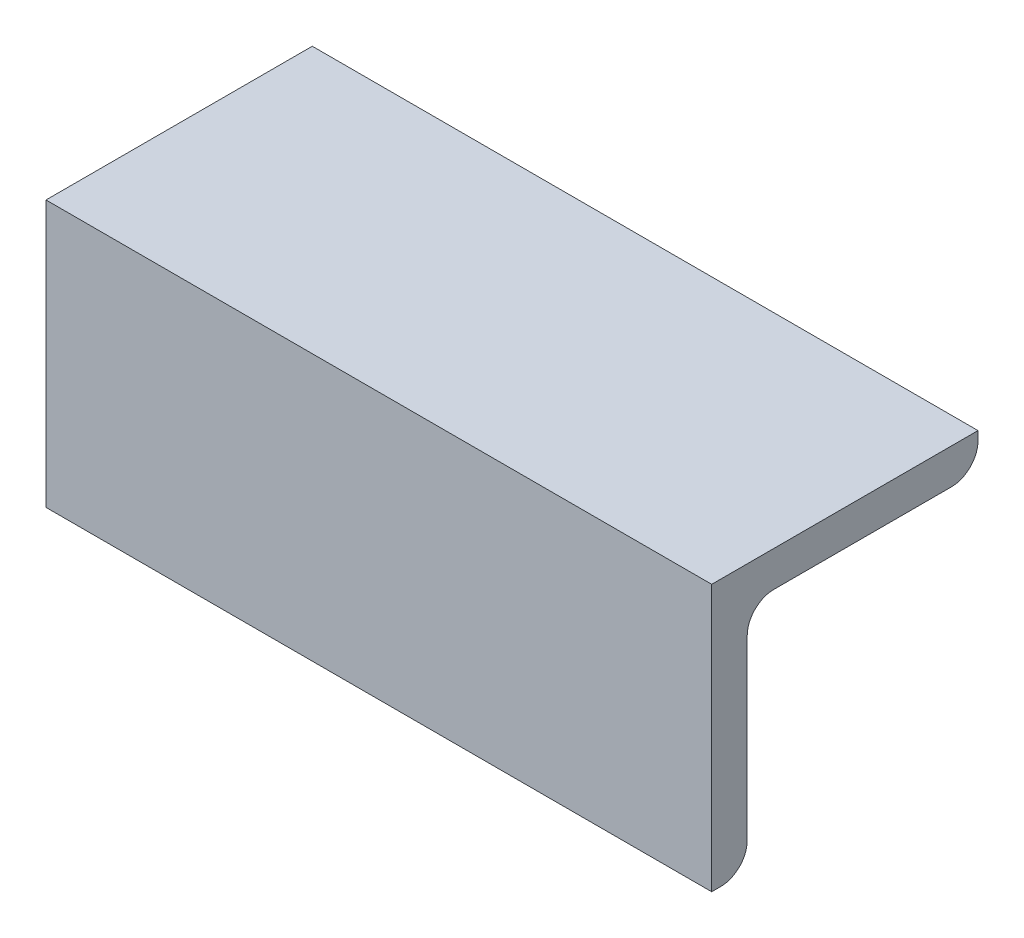
ISO-10303-21;
HEADER;
FILE_DESCRIPTION(('STEP AP214'),'2;1');
FILE_NAME('part.step','',(''),(''),'','','');
FILE_SCHEMA(('AUTOMOTIVE_DESIGN { 1 0 10303 214 1 1 1 1 }'));
ENDSEC;
DATA;
#1=APPLICATION_CONTEXT('core data for automotive mechanical design processes');
#2=APPLICATION_PROTOCOL_DEFINITION('international standard','automotive_design',2000,#1);
#3=PRODUCT_CONTEXT('',#1,'mechanical');
#4=PRODUCT('Part','Part','',(#3));
#5=PRODUCT_RELATED_PRODUCT_CATEGORY('part','',(#4));
#6=PRODUCT_DEFINITION_FORMATION('','',#4);
#7=PRODUCT_DEFINITION_CONTEXT('part definition',#1,'design');
#8=PRODUCT_DEFINITION('design','',#6,#7);
#9=PRODUCT_DEFINITION_SHAPE('','',#8);
#10=(LENGTH_UNIT() NAMED_UNIT(*) SI_UNIT(.MILLI.,.METRE.));
#11=(NAMED_UNIT(*) PLANE_ANGLE_UNIT() SI_UNIT($,.RADIAN.));
#12=(NAMED_UNIT(*) SI_UNIT($,.STERADIAN.) SOLID_ANGLE_UNIT());
#13=UNCERTAINTY_MEASURE_WITH_UNIT(LENGTH_MEASURE(1.E-05),#10,'distance_accuracy_value','');
#14=(GEOMETRIC_REPRESENTATION_CONTEXT(3) GLOBAL_UNCERTAINTY_ASSIGNED_CONTEXT((#13)) GLOBAL_UNIT_ASSIGNED_CONTEXT((#10,
#11,#12)) REPRESENTATION_CONTEXT('',''));
#15=CARTESIAN_POINT('',(0.,0.,0.));
#16=DIRECTION('',(0.,0.,1.));
#17=DIRECTION('',(1.,0.,0.));
#18=AXIS2_PLACEMENT_3D('',#15,#16,#17);
#19=CARTESIAN_POINT('',(75.,15.289592760181,0.));
#20=DIRECTION('',(0.,0.,1.));
#21=DIRECTION('',(0.,-1.,0.));
#22=AXIS2_PLACEMENT_3D('',#19,#20,#21);
#23=PLANE('',#22);
#24=DIRECTION('',(0.,1.,0.));
#25=VECTOR('',#24,1.);
#26=CARTESIAN_POINT('',(0.,15.289592760181,0.));
#27=LINE('',#26,#25);
#28=CARTESIAN_POINT('',(0.,15.289592760181,0.));
#29=VERTEX_POINT('',#28);
#30=CARTESIAN_POINT('',(0.,16.289592760181,0.));
#31=VERTEX_POINT('',#30);
#32=EDGE_CURVE('E135',#29,#31,#27,.T.);
#33=ORIENTED_EDGE('',*,*,#32,.T.);
#34=DIRECTION('',(-1.,0.,0.));
#35=VECTOR('',#34,1.);
#36=CARTESIAN_POINT('',(75.,16.289592760181,0.));
#37=LINE('',#36,#35);
#38=CARTESIAN_POINT('',(75.,16.289592760181,0.));
#39=VERTEX_POINT('',#38);
#40=EDGE_CURVE('E11',#39,#31,#37,.T.);
#41=ORIENTED_EDGE('',*,*,#40,.F.);
#42=DIRECTION('',(0.,1.,0.));
#43=VECTOR('',#42,1.);
#44=CARTESIAN_POINT('',(75.,15.289592760181,0.));
#45=LINE('',#44,#43);
#46=CARTESIAN_POINT('',(75.,15.289592760181,0.));
#47=VERTEX_POINT('',#46);
#48=EDGE_CURVE('E151',#47,#39,#45,.T.);
#49=ORIENTED_EDGE('',*,*,#48,.F.);
#50=DIRECTION('',(-1.,0.,0.));
#51=VECTOR('',#50,1.);
#52=CARTESIAN_POINT('',(75.,15.289592760181,0.));
#53=LINE('',#52,#51);
#54=EDGE_CURVE('E131',#47,#29,#53,.T.);
#55=ORIENTED_EDGE('',*,*,#54,.T.);
#56=EDGE_LOOP('',(#33,#41,#49,#55));
#57=FACE_BOUND('',#56,.T.);
#58=ADVANCED_FACE('F33',(#57),#23,.F.);
#59=CARTESIAN_POINT('',(75.,16.289592760181,0.));
#60=DIRECTION('',(0.,-1.,0.));
#61=DIRECTION('',(0.,0.,-1.));
#62=AXIS2_PLACEMENT_3D('',#59,#60,#61);
#63=PLANE('',#62);
#64=DIRECTION('',(0.,0.,1.));
#65=VECTOR('',#64,1.);
#66=CARTESIAN_POINT('',(0.,16.289592760181,0.));
#67=LINE('',#66,#65);
#68=CARTESIAN_POINT('',(0.,16.289592760181,30.));
#69=VERTEX_POINT('',#68);
#70=EDGE_CURVE('E138',#31,#69,#67,.T.);
#71=ORIENTED_EDGE('',*,*,#70,.T.);
#72=DIRECTION('',(-1.,0.,0.));
#73=VECTOR('',#72,1.);
#74=CARTESIAN_POINT('',(75.,16.289592760181,30.));
#75=LINE('',#74,#73);
#76=CARTESIAN_POINT('',(75.,16.289592760181,30.));
#77=VERTEX_POINT('',#76);
#78=EDGE_CURVE('E41',#77,#69,#75,.T.);
#79=ORIENTED_EDGE('',*,*,#78,.F.);
#80=DIRECTION('',(0.,0.,1.));
#81=VECTOR('',#80,1.);
#82=CARTESIAN_POINT('',(75.,16.289592760181,0.));
#83=LINE('',#82,#81);
#84=EDGE_CURVE('E95',#39,#77,#83,.T.);
#85=ORIENTED_EDGE('',*,*,#84,.F.);
#86=ORIENTED_EDGE('',*,*,#40,.T.);
#87=EDGE_LOOP('',(#71,#79,#85,#86));
#88=FACE_BOUND('',#87,.T.);
#89=ADVANCED_FACE('F194',(#88),#63,.F.);
#90=CARTESIAN_POINT('',(75.,16.289592760181,30.));
#91=DIRECTION('',(0.,0.,-1.));
#92=DIRECTION('',(-1.,0.,0.));
#93=AXIS2_PLACEMENT_3D('',#90,#91,#92);
#94=PLANE('',#93);
#95=DIRECTION('',(0.,-1.,0.));
#96=VECTOR('',#95,1.);
#97=CARTESIAN_POINT('',(0.,16.289592760181,30.));
#98=LINE('',#97,#96);
#99=CARTESIAN_POINT('',(0.,-13.710407239819,30.));
#100=VERTEX_POINT('',#99);
#101=EDGE_CURVE('E140',#69,#100,#98,.T.);
#102=ORIENTED_EDGE('',*,*,#101,.T.);
#103=DIRECTION('',(-1.,0.,0.));
#104=VECTOR('',#103,1.);
#105=CARTESIAN_POINT('',(75.,-13.710407239819,30.));
#106=LINE('',#105,#104);
#107=CARTESIAN_POINT('',(75.,-13.710407239819,30.));
#108=VERTEX_POINT('',#107);
#109=EDGE_CURVE('E161',#108,#100,#106,.T.);
#110=ORIENTED_EDGE('',*,*,#109,.F.);
#111=DIRECTION('',(0.,-1.,0.));
#112=VECTOR('',#111,1.);
#113=CARTESIAN_POINT('',(75.,16.289592760181,30.));
#114=LINE('',#113,#112);
#115=EDGE_CURVE('E169',#77,#108,#114,.T.);
#116=ORIENTED_EDGE('',*,*,#115,.F.);
#117=ORIENTED_EDGE('',*,*,#78,.T.);
#118=EDGE_LOOP('',(#102,#110,#116,#117));
#119=FACE_BOUND('',#118,.T.);
#120=ADVANCED_FACE('F167',(#119),#94,.F.);
#121=CARTESIAN_POINT('',(75.,-13.710407239819,30.));
#122=DIRECTION('',(0.,1.,0.));
#123=DIRECTION('',(0.,0.,1.));
#124=AXIS2_PLACEMENT_3D('',#121,#122,#123);
#125=PLANE('',#124);
#126=DIRECTION('',(0.,0.,-1.));
#127=VECTOR('',#126,1.);
#128=CARTESIAN_POINT('',(0.,-13.710407239819,30.));
#129=LINE('',#128,#127);
#130=CARTESIAN_POINT('',(0.,-13.710407239819,29.));
#131=VERTEX_POINT('',#130);
#132=EDGE_CURVE('E142',#100,#131,#129,.T.);
#133=ORIENTED_EDGE('',*,*,#132,.T.);
#134=DIRECTION('',(-1.,0.,0.));
#135=VECTOR('',#134,1.);
#136=CARTESIAN_POINT('',(75.,-13.710407239819,29.));
#137=LINE('',#136,#135);
#138=CARTESIAN_POINT('',(75.,-13.710407239819,29.));
#139=VERTEX_POINT('',#138);
#140=EDGE_CURVE('E158',#139,#131,#137,.T.);
#141=ORIENTED_EDGE('',*,*,#140,.F.);
#142=DIRECTION('',(0.,0.,-1.));
#143=VECTOR('',#142,1.);
#144=CARTESIAN_POINT('',(75.,-13.710407239819,30.));
#145=LINE('',#144,#143);
#146=EDGE_CURVE('E185',#108,#139,#145,.T.);
#147=ORIENTED_EDGE('',*,*,#146,.F.);
#148=ORIENTED_EDGE('',*,*,#109,.T.);
#149=EDGE_LOOP('',(#133,#141,#147,#148));
#150=FACE_BOUND('',#149,.T.);
#151=ADVANCED_FACE('F178',(#150),#125,.F.);
#152=CARTESIAN_POINT('',(75.,-10.710407239819,29.));
#153=DIRECTION('',(-1.,0.,0.));
#154=DIRECTION('',(0.,0.,1.));
#155=AXIS2_PLACEMENT_3D('',#152,#153,#154);
#156=CYLINDRICAL_SURFACE('',#155,3.);
#157=CARTESIAN_POINT('',(0.,-10.710407239819,29.));
#158=DIRECTION('',(1.,0.,0.));
#159=DIRECTION('',(0.,0.,-1.));
#160=AXIS2_PLACEMENT_3D('',#157,#158,#159);
#161=CIRCLE('',#160,3.);
#162=CARTESIAN_POINT('',(0.,-10.710407239819,26.));
#163=VERTEX_POINT('',#162);
#164=EDGE_CURVE('E144',#131,#163,#161,.T.);
#165=ORIENTED_EDGE('',*,*,#164,.T.);
#166=DIRECTION('',(-1.,0.,0.));
#167=VECTOR('',#166,1.);
#168=CARTESIAN_POINT('',(75.,-10.710407239819,26.));
#169=LINE('',#168,#167);
#170=CARTESIAN_POINT('',(75.,-10.710407239819,26.));
#171=VERTEX_POINT('',#170);
#172=EDGE_CURVE('E155',#171,#163,#169,.T.);
#173=ORIENTED_EDGE('',*,*,#172,.F.);
#174=CARTESIAN_POINT('',(75.,-10.710407239819,29.));
#175=DIRECTION('',(1.,0.,0.));
#176=DIRECTION('',(0.,0.,-1.));
#177=AXIS2_PLACEMENT_3D('',#174,#175,#176);
#178=CIRCLE('',#177,3.);
#179=EDGE_CURVE('E184',#139,#171,#178,.T.);
#180=ORIENTED_EDGE('',*,*,#179,.F.);
#181=ORIENTED_EDGE('',*,*,#140,.T.);
#182=EDGE_LOOP('',(#165,#173,#180,#181));
#183=FACE_BOUND('',#182,.T.);
#184=ADVANCED_FACE('F182',(#183),#156,.T.);
#185=CARTESIAN_POINT('',(75.,-10.710407239819,26.));
#186=DIRECTION('',(0.,0.,1.));
#187=DIRECTION('',(1.,0.,0.));
#188=AXIS2_PLACEMENT_3D('',#185,#186,#187);
#189=PLANE('',#188);
#190=DIRECTION('',(0.,1.,0.));
#191=VECTOR('',#190,1.);
#192=CARTESIAN_POINT('',(0.,-10.710407239819,26.));
#193=LINE('',#192,#191);
#194=CARTESIAN_POINT('',(0.,9.28959276018097,26.));
#195=VERTEX_POINT('',#194);
#196=EDGE_CURVE('E146',#163,#195,#193,.T.);
#197=ORIENTED_EDGE('',*,*,#196,.T.);
#198=DIRECTION('',(-1.,0.,0.));
#199=VECTOR('',#198,1.);
#200=CARTESIAN_POINT('',(75.,9.28959276018097,26.));
#201=LINE('',#200,#199);
#202=CARTESIAN_POINT('',(75.,9.28959276018097,26.));
#203=VERTEX_POINT('',#202);
#204=EDGE_CURVE('E126',#203,#195,#201,.T.);
#205=ORIENTED_EDGE('',*,*,#204,.F.);
#206=DIRECTION('',(0.,1.,0.));
#207=VECTOR('',#206,1.);
#208=CARTESIAN_POINT('',(75.,-10.710407239819,26.));
#209=LINE('',#208,#207);
#210=EDGE_CURVE('E117',#171,#203,#209,.T.);
#211=ORIENTED_EDGE('',*,*,#210,.F.);
#212=ORIENTED_EDGE('',*,*,#172,.T.);
#213=EDGE_LOOP('',(#197,#205,#211,#212));
#214=FACE_BOUND('',#213,.T.);
#215=ADVANCED_FACE('F206',(#214),#189,.F.);
#216=CARTESIAN_POINT('',(75.,9.28959276018099,23.));
#217=DIRECTION('',(-1.,0.,0.));
#218=DIRECTION('',(0.,0.,1.));
#219=AXIS2_PLACEMENT_3D('',#216,#217,#218);
#220=CYLINDRICAL_SURFACE('',#219,3.);
#221=CARTESIAN_POINT('',(0.,9.28959276018099,23.));
#222=DIRECTION('',(-1.,0.,0.));
#223=DIRECTION('',(0.,0.,1.));
#224=AXIS2_PLACEMENT_3D('',#221,#222,#223);
#225=CIRCLE('',#224,3.);
#226=CARTESIAN_POINT('',(0.,12.289592760181,23.));
#227=VERTEX_POINT('',#226);
#228=EDGE_CURVE('E125',#195,#227,#225,.T.);
#229=ORIENTED_EDGE('',*,*,#228,.T.);
#230=DIRECTION('',(-1.,0.,0.));
#231=VECTOR('',#230,1.);
#232=CARTESIAN_POINT('',(75.,12.289592760181,23.));
#233=LINE('',#232,#231);
#234=CARTESIAN_POINT('',(75.,12.289592760181,23.));
#235=VERTEX_POINT('',#234);
#236=EDGE_CURVE('E122',#235,#227,#233,.T.);
#237=ORIENTED_EDGE('',*,*,#236,.F.);
#238=CARTESIAN_POINT('',(75.,9.28959276018099,23.));
#239=DIRECTION('',(-1.,0.,0.));
#240=DIRECTION('',(0.,0.,1.));
#241=AXIS2_PLACEMENT_3D('',#238,#239,#240);
#242=CIRCLE('',#241,3.);
#243=EDGE_CURVE('E111',#203,#235,#242,.T.);
#244=ORIENTED_EDGE('',*,*,#243,.F.);
#245=ORIENTED_EDGE('',*,*,#204,.T.);
#246=EDGE_LOOP('',(#229,#237,#244,#245));
#247=FACE_BOUND('',#246,.T.);
#248=ADVANCED_FACE('F123',(#247),#220,.F.);
#249=CARTESIAN_POINT('',(75.,12.289592760181,23.));
#250=DIRECTION('',(0.,1.,0.));
#251=DIRECTION('',(0.,0.,1.));
#252=AXIS2_PLACEMENT_3D('',#249,#250,#251);
#253=PLANE('',#252);
#254=DIRECTION('',(0.,0.,-1.));
#255=VECTOR('',#254,1.);
#256=CARTESIAN_POINT('',(0.,12.289592760181,23.));
#257=LINE('',#256,#255);
#258=CARTESIAN_POINT('',(0.,12.289592760181,3.00000000000002));
#259=VERTEX_POINT('',#258);
#260=EDGE_CURVE('E81',#227,#259,#257,.T.);
#261=ORIENTED_EDGE('',*,*,#260,.T.);
#262=DIRECTION('',(-1.,0.,0.));
#263=VECTOR('',#262,1.);
#264=CARTESIAN_POINT('',(75.,12.289592760181,3.00000000000002));
#265=LINE('',#264,#263);
#266=CARTESIAN_POINT('',(75.,12.289592760181,3.00000000000002));
#267=VERTEX_POINT('',#266);
#268=EDGE_CURVE('E127',#267,#259,#265,.T.);
#269=ORIENTED_EDGE('',*,*,#268,.F.);
#270=DIRECTION('',(0.,0.,-1.));
#271=VECTOR('',#270,1.);
#272=CARTESIAN_POINT('',(75.,12.289592760181,23.));
#273=LINE('',#272,#271);
#274=EDGE_CURVE('E115',#235,#267,#273,.T.);
#275=ORIENTED_EDGE('',*,*,#274,.F.);
#276=ORIENTED_EDGE('',*,*,#236,.T.);
#277=EDGE_LOOP('',(#261,#269,#275,#276));
#278=FACE_BOUND('',#277,.T.);
#279=ADVANCED_FACE('F129',(#278),#253,.F.);
#280=CARTESIAN_POINT('',(75.,15.289592760181,3.));
#281=DIRECTION('',(-1.,0.,0.));
#282=DIRECTION('',(0.,0.,1.));
#283=AXIS2_PLACEMENT_3D('',#280,#281,#282);
#284=CYLINDRICAL_SURFACE('',#283,3.);
#285=CARTESIAN_POINT('',(0.,15.289592760181,3.));
#286=DIRECTION('',(1.,0.,0.));
#287=DIRECTION('',(0.,0.,-1.));
#288=AXIS2_PLACEMENT_3D('',#285,#286,#287);
#289=CIRCLE('',#288,3.);
#290=EDGE_CURVE('E87',#259,#29,#289,.T.);
#291=ORIENTED_EDGE('',*,*,#290,.T.);
#292=ORIENTED_EDGE('',*,*,#54,.F.);
#293=CARTESIAN_POINT('',(75.,15.289592760181,3.));
#294=DIRECTION('',(1.,0.,0.));
#295=DIRECTION('',(0.,0.,-1.));
#296=AXIS2_PLACEMENT_3D('',#293,#294,#295);
#297=CIRCLE('',#296,3.);
#298=EDGE_CURVE('E49',#267,#47,#297,.T.);
#299=ORIENTED_EDGE('',*,*,#298,.F.);
#300=ORIENTED_EDGE('',*,*,#268,.T.);
#301=EDGE_LOOP('',(#291,#292,#299,#300));
#302=FACE_BOUND('',#301,.T.);
#303=ADVANCED_FACE('F214',(#302),#284,.T.);
#304=CARTESIAN_POINT('',(75.,-10.710407239819,29.));
#305=DIRECTION('',(1.,0.,0.));
#306=DIRECTION('',(0.,0.,-1.));
#307=AXIS2_PLACEMENT_3D('',#304,#305,#306);
#308=PLANE('',#307);
#309=ORIENTED_EDGE('',*,*,#48,.T.);
#310=ORIENTED_EDGE('',*,*,#84,.T.);
#311=ORIENTED_EDGE('',*,*,#115,.T.);
#312=ORIENTED_EDGE('',*,*,#146,.T.);
#313=ORIENTED_EDGE('',*,*,#179,.T.);
#314=ORIENTED_EDGE('',*,*,#210,.T.);
#315=ORIENTED_EDGE('',*,*,#243,.T.);
#316=ORIENTED_EDGE('',*,*,#274,.T.);
#317=ORIENTED_EDGE('',*,*,#298,.T.);
#318=EDGE_LOOP('',(#309,#310,#311,#312,#313,#314,#315,#316,#317));
#319=FACE_BOUND('',#318,.T.);
#320=ADVANCED_FACE('F113',(#319),#308,.T.);
#321=CARTESIAN_POINT('',(0.,-10.710407239819,29.));
#322=DIRECTION('',(1.,0.,0.));
#323=DIRECTION('',(0.,0.,-1.));
#324=AXIS2_PLACEMENT_3D('',#321,#322,#323);
#325=PLANE('',#324);
#326=ORIENTED_EDGE('',*,*,#32,.F.);
#327=ORIENTED_EDGE('',*,*,#290,.F.);
#328=ORIENTED_EDGE('',*,*,#260,.F.);
#329=ORIENTED_EDGE('',*,*,#228,.F.);
#330=ORIENTED_EDGE('',*,*,#196,.F.);
#331=ORIENTED_EDGE('',*,*,#164,.F.);
#332=ORIENTED_EDGE('',*,*,#132,.F.);
#333=ORIENTED_EDGE('',*,*,#101,.F.);
#334=ORIENTED_EDGE('',*,*,#70,.F.);
#335=EDGE_LOOP('',(#326,#327,#328,#329,#330,#331,#332,#333,#334));
#336=FACE_BOUND('',#335,.T.);
#337=ADVANCED_FACE('F173',(#336),#325,.F.);
#338=CLOSED_SHELL('',(#58,#89,#120,#151,#184,#215,#248,#279,#303,#320,#337));
#339=MANIFOLD_SOLID_BREP('B2',#338);
#340=ADVANCED_BREP_SHAPE_REPRESENTATION('',(#18,#339),#14);
#341=SHAPE_DEFINITION_REPRESENTATION(#9,#340);
ENDSEC;
END-ISO-10303-21;
